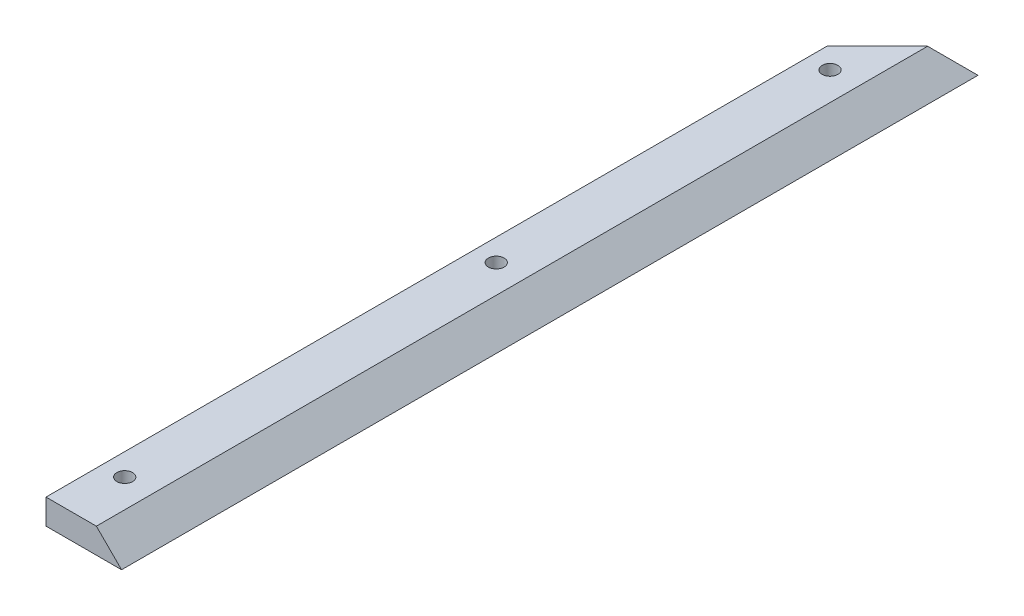
ISO-10303-21;
HEADER;
FILE_DESCRIPTION(('STEP AP214'),'2;1');
FILE_NAME('part.step','',(''),(''),'','','');
FILE_SCHEMA(('AUTOMOTIVE_DESIGN { 1 0 10303 214 1 1 1 1 }'));
ENDSEC;
DATA;
#1=APPLICATION_CONTEXT('core data for automotive mechanical design processes');
#2=APPLICATION_PROTOCOL_DEFINITION('international standard','automotive_design',2000,#1);
#3=PRODUCT_CONTEXT('',#1,'mechanical');
#4=PRODUCT('Part','Part','',(#3));
#5=PRODUCT_RELATED_PRODUCT_CATEGORY('part','',(#4));
#6=PRODUCT_DEFINITION_FORMATION('','',#4);
#7=PRODUCT_DEFINITION_CONTEXT('part definition',#1,'design');
#8=PRODUCT_DEFINITION('design','',#6,#7);
#9=PRODUCT_DEFINITION_SHAPE('','',#8);
#10=(LENGTH_UNIT() NAMED_UNIT(*) SI_UNIT(.MILLI.,.METRE.));
#11=(NAMED_UNIT(*) PLANE_ANGLE_UNIT() SI_UNIT($,.RADIAN.));
#12=(NAMED_UNIT(*) SI_UNIT($,.STERADIAN.) SOLID_ANGLE_UNIT());
#13=UNCERTAINTY_MEASURE_WITH_UNIT(LENGTH_MEASURE(1.E-05),#10,'distance_accuracy_value','');
#14=(GEOMETRIC_REPRESENTATION_CONTEXT(3) GLOBAL_UNCERTAINTY_ASSIGNED_CONTEXT((#13)) GLOBAL_UNIT_ASSIGNED_CONTEXT((#10,
#11,#12)) REPRESENTATION_CONTEXT('',''));
#15=CARTESIAN_POINT('',(0.,0.,0.));
#16=DIRECTION('',(0.,0.,1.));
#17=DIRECTION('',(1.,0.,0.));
#18=AXIS2_PLACEMENT_3D('',#15,#16,#17);
#19=CARTESIAN_POINT('',(-19.05,-6.35,215.9));
#20=DIRECTION('',(1.,0.,0.));
#21=DIRECTION('',(0.,0.,-1.));
#22=AXIS2_PLACEMENT_3D('',#19,#20,#21);
#23=PLANE('',#22);
#24=DIRECTION('',(0.,0.,-1.));
#25=VECTOR('',#24,1.);
#26=CARTESIAN_POINT('',(-19.05,6.35,215.9));
#27=LINE('',#26,#25);
#28=CARTESIAN_POINT('',(-19.05,6.35,215.9));
#29=VERTEX_POINT('',#28);
#30=CARTESIAN_POINT('',(-19.05,6.35,-177.8));
#31=VERTEX_POINT('',#30);
#32=EDGE_CURVE('E96',#29,#31,#27,.T.);
#33=ORIENTED_EDGE('',*,*,#32,.T.);
#34=DIRECTION('',(0.,1.,0.));
#35=VECTOR('',#34,1.);
#36=CARTESIAN_POINT('',(-19.05,-6.35,-177.8));
#37=LINE('',#36,#35);
#38=CARTESIAN_POINT('',(-19.05,-6.35,-177.8));
#39=VERTEX_POINT('',#38);
#40=EDGE_CURVE('E58',#39,#31,#37,.T.);
#41=ORIENTED_EDGE('',*,*,#40,.F.);
#42=DIRECTION('',(0.,0.,-1.));
#43=VECTOR('',#42,1.);
#44=CARTESIAN_POINT('',(-19.05,-6.35,215.9));
#45=LINE('',#44,#43);
#46=CARTESIAN_POINT('',(-19.05,-6.35,215.9));
#47=VERTEX_POINT('',#46);
#48=EDGE_CURVE('E13',#47,#39,#45,.T.);
#49=ORIENTED_EDGE('',*,*,#48,.F.);
#50=DIRECTION('',(0.,-1.,0.));
#51=VECTOR('',#50,1.);
#52=CARTESIAN_POINT('',(-19.05,-6.35,215.9));
#53=LINE('',#52,#51);
#54=EDGE_CURVE('E102',#29,#47,#53,.T.);
#55=ORIENTED_EDGE('',*,*,#54,.F.);
#56=EDGE_LOOP('',(#33,#41,#49,#55));
#57=FACE_BOUND('',#56,.T.);
#58=ADVANCED_FACE('F44',(#57),#23,.F.);
#59=CARTESIAN_POINT('',(-19.05,-6.35,215.9));
#60=DIRECTION('',(0.,1.,0.));
#61=DIRECTION('',(0.,0.,1.));
#62=AXIS2_PLACEMENT_3D('',#59,#60,#61);
#63=PLANE('',#62);
#64=CARTESIAN_POINT('',(-7.9375,-6.35,187.325));
#65=DIRECTION('',(0.,1.,0.));
#66=DIRECTION('',(0.,0.,1.));
#67=AXIS2_PLACEMENT_3D('',#64,#65,#66);
#68=CIRCLE('',#67,3.96874999999999);
#69=CARTESIAN_POINT('',(-7.9375,-6.35,191.29375));
#70=VERTEX_POINT('',#69);
#71=EDGE_CURVE('E132',#70,#70,#68,.T.);
#72=ORIENTED_EDGE('',*,*,#71,.T.);
#73=EDGE_LOOP('',(#72));
#74=FACE_BOUND('',#73,.T.);
#75=CARTESIAN_POINT('',(-7.9375,-6.35,0.));
#76=DIRECTION('',(0.,1.,0.));
#77=DIRECTION('',(0.,0.,1.));
#78=AXIS2_PLACEMENT_3D('',#75,#76,#77);
#79=CIRCLE('',#78,3.96874999999999);
#80=CARTESIAN_POINT('',(-7.9375,-6.35,3.96874999999999));
#81=VERTEX_POINT('',#80);
#82=EDGE_CURVE('E126',#81,#81,#79,.T.);
#83=ORIENTED_EDGE('',*,*,#82,.T.);
#84=EDGE_LOOP('',(#83));
#85=FACE_BOUND('',#84,.T.);
#86=CARTESIAN_POINT('',(-7.9375,-6.35,-168.275));
#87=DIRECTION('',(0.,1.,0.));
#88=DIRECTION('',(0.,0.,1.));
#89=AXIS2_PLACEMENT_3D('',#86,#87,#88);
#90=CIRCLE('',#89,3.96874999999999);
#91=CARTESIAN_POINT('',(-7.9375,-6.35,-164.30625));
#92=VERTEX_POINT('',#91);
#93=EDGE_CURVE('E118',#92,#92,#90,.T.);
#94=ORIENTED_EDGE('',*,*,#93,.T.);
#95=EDGE_LOOP('',(#94));
#96=FACE_BOUND('',#95,.T.);
#97=ORIENTED_EDGE('',*,*,#48,.T.);
#98=DIRECTION('',(0.707106781186548,0.,-0.707106781186547));
#99=VECTOR('',#98,1.);
#100=CARTESIAN_POINT('',(19.05,-6.35,-215.9));
#101=LINE('',#100,#99);
#102=CARTESIAN_POINT('',(19.05,-6.35,-215.9));
#103=VERTEX_POINT('',#102);
#104=EDGE_CURVE('E83',#39,#103,#101,.T.);
#105=ORIENTED_EDGE('',*,*,#104,.T.);
#106=DIRECTION('',(0.,0.,-1.));
#107=VECTOR('',#106,1.);
#108=CARTESIAN_POINT('',(19.05,-6.35,215.9));
#109=LINE('',#108,#107);
#110=CARTESIAN_POINT('',(19.05,-6.35,215.9));
#111=VERTEX_POINT('',#110);
#112=EDGE_CURVE('E51',#111,#103,#109,.T.);
#113=ORIENTED_EDGE('',*,*,#112,.F.);
#114=DIRECTION('',(1.,0.,0.));
#115=VECTOR('',#114,1.);
#116=CARTESIAN_POINT('',(-19.05,-6.35,215.9));
#117=LINE('',#116,#115);
#118=EDGE_CURVE('E99',#47,#111,#117,.T.);
#119=ORIENTED_EDGE('',*,*,#118,.F.);
#120=EDGE_LOOP('',(#97,#105,#113,#119));
#121=FACE_BOUND('',#120,.T.);
#122=ADVANCED_FACE('F98',(#74,#85,#96,#121),#63,.F.);
#123=CARTESIAN_POINT('',(19.05,-6.35,215.9));
#124=DIRECTION('',(-0.707106781186544,-0.707106781186551,0.));
#125=DIRECTION('',(0.707106781186551,-0.707106781186544,0.));
#126=AXIS2_PLACEMENT_3D('',#123,#124,#125);
#127=PLANE('',#126);
#128=ORIENTED_EDGE('',*,*,#112,.T.);
#129=DIRECTION('',(-0.577350269189628,0.577350269189622,0.577350269189628));
#130=VECTOR('',#129,1.);
#131=CARTESIAN_POINT('',(-124.883333333334,137.583333333333,-71.9666666666657));
#132=LINE('',#131,#130);
#133=CARTESIAN_POINT('',(6.34999999999983,6.35,-203.2));
#134=VERTEX_POINT('',#133);
#135=EDGE_CURVE('E86',#103,#134,#132,.T.);
#136=ORIENTED_EDGE('',*,*,#135,.T.);
#137=DIRECTION('',(0.,0.,-1.));
#138=VECTOR('',#137,1.);
#139=CARTESIAN_POINT('',(6.34999999999987,6.35,215.9));
#140=LINE('',#139,#138);
#141=CARTESIAN_POINT('',(6.34999999999987,6.35,215.9));
#142=VERTEX_POINT('',#141);
#143=EDGE_CURVE('E111',#142,#134,#140,.T.);
#144=ORIENTED_EDGE('',*,*,#143,.F.);
#145=DIRECTION('',(-0.707106781186551,0.707106781186544,0.));
#146=VECTOR('',#145,1.);
#147=CARTESIAN_POINT('',(19.05,-6.35,215.9));
#148=LINE('',#147,#146);
#149=EDGE_CURVE('E101',#111,#142,#148,.T.);
#150=ORIENTED_EDGE('',*,*,#149,.F.);
#151=EDGE_LOOP('',(#128,#136,#144,#150));
#152=FACE_BOUND('',#151,.T.);
#153=ADVANCED_FACE('F114',(#152),#127,.F.);
#154=CARTESIAN_POINT('',(-19.05,6.35,215.9));
#155=DIRECTION('',(0.,-1.,0.));
#156=DIRECTION('',(0.,0.,-1.));
#157=AXIS2_PLACEMENT_3D('',#154,#155,#156);
#158=PLANE('',#157);
#159=CARTESIAN_POINT('',(-7.9375,6.35,187.325));
#160=DIRECTION('',(0.,1.,0.));
#161=DIRECTION('',(0.,0.,1.));
#162=AXIS2_PLACEMENT_3D('',#159,#160,#161);
#163=CIRCLE('',#162,3.96874999999999);
#164=CARTESIAN_POINT('',(-7.9375,6.35,191.29375));
#165=VERTEX_POINT('',#164);
#166=EDGE_CURVE('E135',#165,#165,#163,.T.);
#167=ORIENTED_EDGE('',*,*,#166,.F.);
#168=EDGE_LOOP('',(#167));
#169=FACE_BOUND('',#168,.T.);
#170=CARTESIAN_POINT('',(-7.9375,6.35,0.));
#171=DIRECTION('',(0.,1.,0.));
#172=DIRECTION('',(0.,0.,1.));
#173=AXIS2_PLACEMENT_3D('',#170,#171,#172);
#174=CIRCLE('',#173,3.96874999999999);
#175=CARTESIAN_POINT('',(-7.9375,6.35,3.96874999999999));
#176=VERTEX_POINT('',#175);
#177=EDGE_CURVE('E129',#176,#176,#174,.T.);
#178=ORIENTED_EDGE('',*,*,#177,.F.);
#179=EDGE_LOOP('',(#178));
#180=FACE_BOUND('',#179,.T.);
#181=CARTESIAN_POINT('',(-7.9375,6.35,-168.275));
#182=DIRECTION('',(0.,1.,0.));
#183=DIRECTION('',(0.,0.,1.));
#184=AXIS2_PLACEMENT_3D('',#181,#182,#183);
#185=CIRCLE('',#184,3.96874999999999);
#186=CARTESIAN_POINT('',(-7.9375,6.35,-164.30625));
#187=VERTEX_POINT('',#186);
#188=EDGE_CURVE('E121',#187,#187,#185,.T.);
#189=ORIENTED_EDGE('',*,*,#188,.F.);
#190=EDGE_LOOP('',(#189));
#191=FACE_BOUND('',#190,.T.);
#192=ORIENTED_EDGE('',*,*,#143,.T.);
#193=DIRECTION('',(0.707106781186548,0.,-0.707106781186547));
#194=VECTOR('',#193,1.);
#195=CARTESIAN_POINT('',(19.05,6.35,-215.9));
#196=LINE('',#195,#194);
#197=EDGE_CURVE('E90',#31,#134,#196,.T.);
#198=ORIENTED_EDGE('',*,*,#197,.F.);
#199=ORIENTED_EDGE('',*,*,#32,.F.);
#200=DIRECTION('',(-1.,0.,0.));
#201=VECTOR('',#200,1.);
#202=CARTESIAN_POINT('',(-19.05,6.35,215.9));
#203=LINE('',#202,#201);
#204=EDGE_CURVE('E66',#142,#29,#203,.T.);
#205=ORIENTED_EDGE('',*,*,#204,.F.);
#206=EDGE_LOOP('',(#192,#198,#199,#205));
#207=FACE_BOUND('',#206,.T.);
#208=ADVANCED_FACE('F117',(#169,#180,#191,#207),#158,.F.);
#209=CARTESIAN_POINT('',(0.,0.,215.9));
#210=DIRECTION('',(0.,0.,-1.));
#211=DIRECTION('',(-1.,0.,0.));
#212=AXIS2_PLACEMENT_3D('',#209,#210,#211);
#213=PLANE('',#212);
#214=ORIENTED_EDGE('',*,*,#54,.T.);
#215=ORIENTED_EDGE('',*,*,#118,.T.);
#216=ORIENTED_EDGE('',*,*,#149,.T.);
#217=ORIENTED_EDGE('',*,*,#204,.T.);
#218=EDGE_LOOP('',(#214,#215,#216,#217));
#219=FACE_BOUND('',#218,.T.);
#220=ADVANCED_FACE('F104',(#219),#213,.F.);
#221=CARTESIAN_POINT('',(19.05,-6.35,-215.9));
#222=DIRECTION('',(0.707106781186547,0.,0.707106781186548));
#223=DIRECTION('',(0.707106781186548,0.,-0.707106781186547));
#224=AXIS2_PLACEMENT_3D('',#221,#222,#223);
#225=PLANE('',#224);
#226=ORIENTED_EDGE('',*,*,#104,.F.);
#227=ORIENTED_EDGE('',*,*,#40,.T.);
#228=ORIENTED_EDGE('',*,*,#197,.T.);
#229=ORIENTED_EDGE('',*,*,#135,.F.);
#230=EDGE_LOOP('',(#226,#227,#228,#229));
#231=FACE_BOUND('',#230,.T.);
#232=ADVANCED_FACE('F84',(#231),#225,.F.);
#233=CARTESIAN_POINT('',(-7.9375,6.35,-168.275));
#234=DIRECTION('',(0.,1.,0.));
#235=DIRECTION('',(0.,0.,1.));
#236=AXIS2_PLACEMENT_3D('',#233,#234,#235);
#237=CYLINDRICAL_SURFACE('',#236,3.96874999999999);
#238=ORIENTED_EDGE('',*,*,#93,.F.);
#239=EDGE_LOOP('',(#238));
#240=FACE_BOUND('',#239,.T.);
#241=ORIENTED_EDGE('',*,*,#188,.T.);
#242=EDGE_LOOP('',(#241));
#243=FACE_BOUND('',#242,.T.);
#244=ADVANCED_FACE('F148',(#240,#243),#237,.F.);
#245=CARTESIAN_POINT('',(-7.9375,6.35,0.));
#246=DIRECTION('',(0.,1.,0.));
#247=DIRECTION('',(0.,0.,1.));
#248=AXIS2_PLACEMENT_3D('',#245,#246,#247);
#249=CYLINDRICAL_SURFACE('',#248,3.96874999999999);
#250=ORIENTED_EDGE('',*,*,#82,.F.);
#251=EDGE_LOOP('',(#250));
#252=FACE_BOUND('',#251,.T.);
#253=ORIENTED_EDGE('',*,*,#177,.T.);
#254=EDGE_LOOP('',(#253));
#255=FACE_BOUND('',#254,.T.);
#256=ADVANCED_FACE('F150',(#252,#255),#249,.F.);
#257=CARTESIAN_POINT('',(-7.9375,6.35,187.325));
#258=DIRECTION('',(0.,1.,0.));
#259=DIRECTION('',(0.,0.,1.));
#260=AXIS2_PLACEMENT_3D('',#257,#258,#259);
#261=CYLINDRICAL_SURFACE('',#260,3.96874999999999);
#262=ORIENTED_EDGE('',*,*,#71,.F.);
#263=EDGE_LOOP('',(#262));
#264=FACE_BOUND('',#263,.T.);
#265=ORIENTED_EDGE('',*,*,#166,.T.);
#266=EDGE_LOOP('',(#265));
#267=FACE_BOUND('',#266,.T.);
#268=ADVANCED_FACE('F139',(#264,#267),#261,.F.);
#269=CLOSED_SHELL('',(#58,#122,#153,#208,#220,#232,#244,#256,#268));
#270=MANIFOLD_SOLID_BREP('B2',#269);
#271=ADVANCED_BREP_SHAPE_REPRESENTATION('',(#18,#270),#14);
#272=SHAPE_DEFINITION_REPRESENTATION(#9,#271);
ENDSEC;
END-ISO-10303-21;
